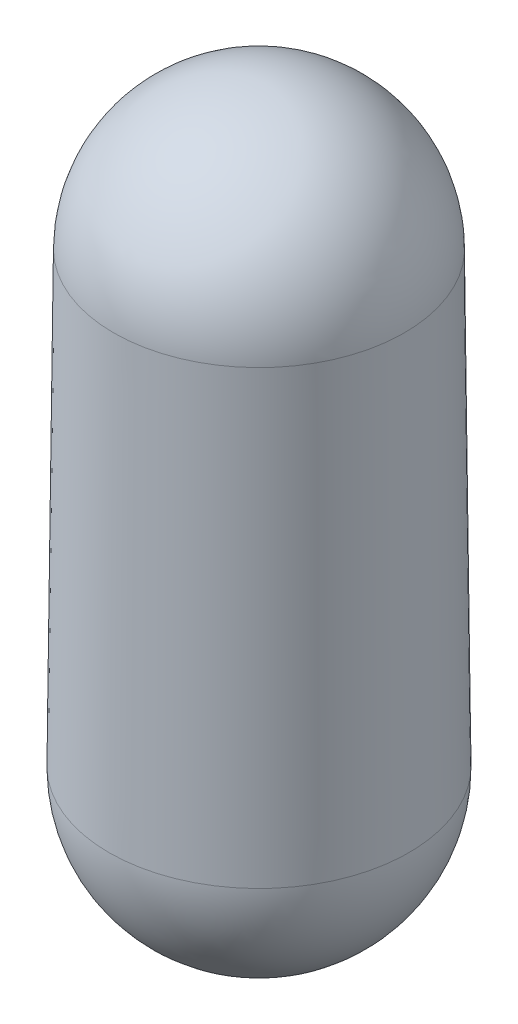
ISO-10303-21;
HEADER;
FILE_DESCRIPTION(('STEP AP214'),'2;1');
FILE_NAME('part.step','',(''),(''),'','','');
FILE_SCHEMA(('AUTOMOTIVE_DESIGN { 1 0 10303 214 1 1 1 1 }'));
ENDSEC;
DATA;
#1=APPLICATION_CONTEXT('core data for automotive mechanical design processes');
#2=APPLICATION_PROTOCOL_DEFINITION('international standard','automotive_design',2000,#1);
#3=PRODUCT_CONTEXT('',#1,'mechanical');
#4=PRODUCT('Part','Part','',(#3));
#5=PRODUCT_RELATED_PRODUCT_CATEGORY('part','',(#4));
#6=PRODUCT_DEFINITION_FORMATION('','',#4);
#7=PRODUCT_DEFINITION_CONTEXT('part definition',#1,'design');
#8=PRODUCT_DEFINITION('design','',#6,#7);
#9=PRODUCT_DEFINITION_SHAPE('','',#8);
#10=(LENGTH_UNIT() NAMED_UNIT(*) SI_UNIT(.MILLI.,.METRE.));
#11=(NAMED_UNIT(*) PLANE_ANGLE_UNIT() SI_UNIT($,.RADIAN.));
#12=(NAMED_UNIT(*) SI_UNIT($,.STERADIAN.) SOLID_ANGLE_UNIT());
#13=UNCERTAINTY_MEASURE_WITH_UNIT(LENGTH_MEASURE(1.E-05),#10,'distance_accuracy_value','');
#14=(GEOMETRIC_REPRESENTATION_CONTEXT(3) GLOBAL_UNCERTAINTY_ASSIGNED_CONTEXT((#13)) GLOBAL_UNIT_ASSIGNED_CONTEXT((#10,
#11,#12)) REPRESENTATION_CONTEXT('',''));
#15=CARTESIAN_POINT('',(0.,0.,0.));
#16=DIRECTION('',(0.,0.,1.));
#17=DIRECTION('',(1.,0.,0.));
#18=AXIS2_PLACEMENT_3D('',#15,#16,#17);
#19=CARTESIAN_POINT('',(0.,-2480.94431781166,0.));
#20=DIRECTION('',(0.,-1.,0.));
#21=DIRECTION('',(1.,0.,0.));
#22=AXIS2_PLACEMENT_3D('',#19,#20,#21);
#23=CYLINDRICAL_SURFACE('',#22,38.989);
#24=CARTESIAN_POINT('',(0.,-2511.17031781166,0.));
#25=DIRECTION('',(0.,-1.,0.));
#26=DIRECTION('',(1.,0.,0.));
#27=AXIS2_PLACEMENT_3D('',#24,#25,#26);
#28=CIRCLE('',#27,38.989);
#29=CARTESIAN_POINT('',(38.989,-2511.17031781166,0.));
#30=VERTEX_POINT('',#29);
#31=EDGE_CURVE('E164',#30,#30,#28,.T.);
#32=ORIENTED_EDGE('',*,*,#31,.T.);
#33=EDGE_LOOP('',(#32));
#34=FACE_BOUND('',#33,.T.);
#35=CARTESIAN_POINT('',(0.,-2501.51831781166,0.));
#36=DIRECTION('',(0.,1.,0.));
#37=DIRECTION('',(-1.,0.,0.));
#38=AXIS2_PLACEMENT_3D('',#35,#36,#37);
#39=CIRCLE('',#38,38.989);
#40=CARTESIAN_POINT('',(-38.989,-2501.51831781166,0.));
#41=VERTEX_POINT('',#40);
#42=EDGE_CURVE('E51',#41,#41,#39,.F.);
#43=ORIENTED_EDGE('',*,*,#42,.F.);
#44=EDGE_LOOP('',(#43));
#45=FACE_BOUND('',#44,.T.);
#46=ADVANCED_FACE('F47',(#34,#45),#23,.F.);
#47=CARTESIAN_POINT('',(0.,-2480.94431781166,0.));
#48=DIRECTION('',(0.,-1.,0.));
#49=DIRECTION('',(1.,0.,0.));
#50=AXIS2_PLACEMENT_3D('',#47,#48,#49);
#51=CYLINDRICAL_SURFACE('',#50,54.102);
#52=CARTESIAN_POINT('',(0.,-2509.58281781166,0.));
#53=DIRECTION('',(0.,-1.,0.));
#54=DIRECTION('',(1.,0.,0.));
#55=AXIS2_PLACEMENT_3D('',#52,#53,#54);
#56=CIRCLE('',#55,54.102);
#57=CARTESIAN_POINT('',(54.102,-2509.58281781166,0.));
#58=VERTEX_POINT('',#57);
#59=EDGE_CURVE('E11',#58,#58,#56,.F.);
#60=ORIENTED_EDGE('',*,*,#59,.F.);
#61=EDGE_LOOP('',(#60));
#62=FACE_BOUND('',#61,.T.);
#63=CARTESIAN_POINT('',(0.,-2511.17031781166,0.));
#64=DIRECTION('',(0.,-1.,0.));
#65=DIRECTION('',(1.,0.,0.));
#66=AXIS2_PLACEMENT_3D('',#63,#64,#65);
#67=CIRCLE('',#66,54.102);
#68=CARTESIAN_POINT('',(54.102,-2511.17031781166,0.));
#69=VERTEX_POINT('',#68);
#70=EDGE_CURVE('E60',#69,#69,#67,.T.);
#71=ORIENTED_EDGE('',*,*,#70,.F.);
#72=EDGE_LOOP('',(#71));
#73=FACE_BOUND('',#72,.T.);
#74=ADVANCED_FACE('F49',(#62,#73),#51,.T.);
#75=CARTESIAN_POINT('',(0.,-2511.17031781166,0.));
#76=DIRECTION('',(0.,-1.,0.));
#77=DIRECTION('',(1.,0.,0.));
#78=AXIS2_PLACEMENT_3D('',#75,#76,#77);
#79=PLANE('',#78);
#80=ORIENTED_EDGE('',*,*,#31,.F.);
#81=EDGE_LOOP('',(#80));
#82=FACE_BOUND('',#81,.T.);
#83=ORIENTED_EDGE('',*,*,#70,.T.);
#84=EDGE_LOOP('',(#83));
#85=FACE_BOUND('',#84,.T.);
#86=ADVANCED_FACE('F105',(#82,#85),#79,.T.);
#87=CARTESIAN_POINT('',(0.,-2217.88663417959,0.));
#88=DIRECTION('',(0.,-1.,0.));
#89=DIRECTION('',(1.,0.,0.));
#90=AXIS2_PLACEMENT_3D('',#87,#88,#89);
#91=CYLINDRICAL_SURFACE('',#90,95.25);
#92=CARTESIAN_POINT('',(0.,-2487.29431781166,0.));
#93=DIRECTION('',(0.,-1.,0.));
#94=DIRECTION('',(1.,0.,0.));
#95=AXIS2_PLACEMENT_3D('',#92,#93,#94);
#96=CIRCLE('',#95,95.25);
#97=CARTESIAN_POINT('',(95.25,-2487.29431781166,0.));
#98=VERTEX_POINT('',#97);
#99=EDGE_CURVE('E72',#98,#98,#96,.F.);
#100=ORIENTED_EDGE('',*,*,#99,.F.);
#101=EDGE_LOOP('',(#100));
#102=FACE_BOUND('',#101,.T.);
#103=CARTESIAN_POINT('',(0.,-2509.58281781166,0.));
#104=DIRECTION('',(0.,-1.,0.));
#105=DIRECTION('',(1.,0.,0.));
#106=AXIS2_PLACEMENT_3D('',#103,#104,#105);
#107=CIRCLE('',#106,95.25);
#108=CARTESIAN_POINT('',(95.25,-2509.58281781166,0.));
#109=VERTEX_POINT('',#108);
#110=EDGE_CURVE('E67',#109,#109,#107,.T.);
#111=ORIENTED_EDGE('',*,*,#110,.F.);
#112=EDGE_LOOP('',(#111));
#113=FACE_BOUND('',#112,.T.);
#114=ADVANCED_FACE('F102',(#102,#113),#91,.T.);
#115=CARTESIAN_POINT('',(0.,-2509.58281781166,0.));
#116=DIRECTION('',(0.,-1.,0.));
#117=DIRECTION('',(1.,0.,0.));
#118=AXIS2_PLACEMENT_3D('',#115,#116,#117);
#119=PLANE('',#118);
#120=CARTESIAN_POINT('',(53.8815367264154,-2509.58281781166,-53.8815367264145));
#121=DIRECTION('',(0.,-1.,0.));
#122=DIRECTION('',(0.,0.,-1.));
#123=AXIS2_PLACEMENT_3D('',#120,#121,#122);
#124=CIRCLE('',#123,9.52499999999999);
#125=CARTESIAN_POINT('',(53.8815367264155,-2509.58281781166,-63.4065367264145));
#126=VERTEX_POINT('',#125);
#127=EDGE_CURVE('E165',#126,#126,#124,.T.);
#128=ORIENTED_EDGE('',*,*,#127,.F.);
#129=EDGE_LOOP('',(#128));
#130=FACE_BOUND('',#129,.T.);
#131=CARTESIAN_POINT('',(-53.8815367264146,-2509.58281781166,-53.8815367264154));
#132=DIRECTION('',(0.,-1.,0.));
#133=DIRECTION('',(-1.,0.,0.));
#134=AXIS2_PLACEMENT_3D('',#131,#132,#133);
#135=CIRCLE('',#134,9.52499999999999);
#136=CARTESIAN_POINT('',(-63.4065367264146,-2509.58281781166,-53.8815367264154));
#137=VERTEX_POINT('',#136);
#138=EDGE_CURVE('E178',#137,#137,#135,.T.);
#139=ORIENTED_EDGE('',*,*,#138,.F.);
#140=EDGE_LOOP('',(#139));
#141=FACE_BOUND('',#140,.T.);
#142=CARTESIAN_POINT('',(-53.881536726415,-2509.58281781166,53.8815367264149));
#143=DIRECTION('',(0.,-1.,0.));
#144=DIRECTION('',(0.,0.,1.));
#145=AXIS2_PLACEMENT_3D('',#142,#143,#144);
#146=CIRCLE('',#145,9.52499999999999);
#147=CARTESIAN_POINT('',(-53.8815367264151,-2509.58281781166,63.4065367264149));
#148=VERTEX_POINT('',#147);
#149=EDGE_CURVE('E80',#148,#148,#146,.T.);
#150=ORIENTED_EDGE('',*,*,#149,.F.);
#151=EDGE_LOOP('',(#150));
#152=FACE_BOUND('',#151,.T.);
#153=CARTESIAN_POINT('',(53.881536726415,-2509.58281781166,53.8815367264149));
#154=DIRECTION('',(0.,-1.,0.));
#155=DIRECTION('',(1.,0.,0.));
#156=AXIS2_PLACEMENT_3D('',#153,#154,#155);
#157=CIRCLE('',#156,9.52499999999999);
#158=CARTESIAN_POINT('',(63.406536726415,-2509.58281781166,53.8815367264149));
#159=VERTEX_POINT('',#158);
#160=EDGE_CURVE('E68',#159,#159,#157,.T.);
#161=ORIENTED_EDGE('',*,*,#160,.F.);
#162=EDGE_LOOP('',(#161));
#163=FACE_BOUND('',#162,.T.);
#164=ORIENTED_EDGE('',*,*,#59,.T.);
#165=EDGE_LOOP('',(#164));
#166=FACE_BOUND('',#165,.T.);
#167=ORIENTED_EDGE('',*,*,#110,.T.);
#168=EDGE_LOOP('',(#167));
#169=FACE_BOUND('',#168,.T.);
#170=ADVANCED_FACE('F97',(#130,#141,#152,#163,#166,#169),#119,.T.);
#171=CARTESIAN_POINT('',(0.,-2487.29431781166,0.));
#172=DIRECTION('',(0.,-1.,0.));
#173=DIRECTION('',(1.,0.,0.));
#174=AXIS2_PLACEMENT_3D('',#171,#172,#173);
#175=PLANE('',#174);
#176=CARTESIAN_POINT('',(53.8815367264154,-2487.29431781166,-53.8815367264145));
#177=DIRECTION('',(0.,-1.,0.));
#178=DIRECTION('',(0.,0.,-1.));
#179=AXIS2_PLACEMENT_3D('',#176,#177,#178);
#180=CIRCLE('',#179,9.52499999999999);
#181=CARTESIAN_POINT('',(53.8815367264155,-2487.29431781166,-63.4065367264145));
#182=VERTEX_POINT('',#181);
#183=EDGE_CURVE('E168',#182,#182,#180,.T.);
#184=ORIENTED_EDGE('',*,*,#183,.T.);
#185=EDGE_LOOP('',(#184));
#186=FACE_BOUND('',#185,.T.);
#187=CARTESIAN_POINT('',(-53.8815367264146,-2487.29431781166,-53.8815367264154));
#188=DIRECTION('',(0.,-1.,0.));
#189=DIRECTION('',(-1.,0.,0.));
#190=AXIS2_PLACEMENT_3D('',#187,#188,#189);
#191=CIRCLE('',#190,9.52499999999999);
#192=CARTESIAN_POINT('',(-63.4065367264146,-2487.29431781166,-53.8815367264154));
#193=VERTEX_POINT('',#192);
#194=EDGE_CURVE('E181',#193,#193,#191,.T.);
#195=ORIENTED_EDGE('',*,*,#194,.T.);
#196=EDGE_LOOP('',(#195));
#197=FACE_BOUND('',#196,.T.);
#198=CARTESIAN_POINT('',(-53.881536726415,-2487.29431781166,53.8815367264149));
#199=DIRECTION('',(0.,-1.,0.));
#200=DIRECTION('',(0.,0.,1.));
#201=AXIS2_PLACEMENT_3D('',#198,#199,#200);
#202=CIRCLE('',#201,9.52499999999999);
#203=CARTESIAN_POINT('',(-53.8815367264151,-2487.29431781166,63.4065367264149));
#204=VERTEX_POINT('',#203);
#205=EDGE_CURVE('E75',#204,#204,#202,.T.);
#206=ORIENTED_EDGE('',*,*,#205,.T.);
#207=EDGE_LOOP('',(#206));
#208=FACE_BOUND('',#207,.T.);
#209=CARTESIAN_POINT('',(53.881536726415,-2487.29431781166,53.8815367264149));
#210=DIRECTION('',(0.,-1.,0.));
#211=DIRECTION('',(1.,0.,0.));
#212=AXIS2_PLACEMENT_3D('',#209,#210,#211);
#213=CIRCLE('',#212,9.52499999999999);
#214=CARTESIAN_POINT('',(63.406536726415,-2487.29431781166,53.8815367264149));
#215=VERTEX_POINT('',#214);
#216=EDGE_CURVE('E65',#215,#215,#213,.T.);
#217=ORIENTED_EDGE('',*,*,#216,.T.);
#218=EDGE_LOOP('',(#217));
#219=FACE_BOUND('',#218,.T.);
#220=CARTESIAN_POINT('',(0.,-2487.29431781166,0.));
#221=DIRECTION('',(0.,-1.,0.));
#222=DIRECTION('',(1.,0.,0.));
#223=AXIS2_PLACEMENT_3D('',#220,#221,#222);
#224=CIRCLE('',#223,54.102);
#225=CARTESIAN_POINT('',(54.102,-2487.29431781166,0.));
#226=VERTEX_POINT('',#225);
#227=EDGE_CURVE('E63',#226,#226,#224,.F.);
#228=ORIENTED_EDGE('',*,*,#227,.F.);
#229=EDGE_LOOP('',(#228));
#230=FACE_BOUND('',#229,.T.);
#231=ORIENTED_EDGE('',*,*,#99,.T.);
#232=EDGE_LOOP('',(#231));
#233=FACE_BOUND('',#232,.T.);
#234=ADVANCED_FACE('F93',(#186,#197,#208,#219,#230,#233),#175,.F.);
#235=CARTESIAN_POINT('',(0.,-2480.94431781166,0.));
#236=DIRECTION('',(0.,-1.,0.));
#237=DIRECTION('',(1.,0.,0.));
#238=AXIS2_PLACEMENT_3D('',#235,#236,#237);
#239=PLANE('',#238);
#240=CARTESIAN_POINT('',(0.,-2480.94431781166,0.));
#241=DIRECTION('',(0.,1.,0.));
#242=DIRECTION('',(-1.,0.,0.));
#243=AXIS2_PLACEMENT_3D('',#240,#241,#242);
#244=CIRCLE('',#243,45.339);
#245=CARTESIAN_POINT('',(-45.339,-2480.94431781166,0.));
#246=VERTEX_POINT('',#245);
#247=EDGE_CURVE('E173',#246,#246,#244,.T.);
#248=ORIENTED_EDGE('',*,*,#247,.F.);
#249=EDGE_LOOP('',(#248));
#250=FACE_BOUND('',#249,.T.);
#251=CARTESIAN_POINT('',(0.,-2480.94431781166,0.));
#252=DIRECTION('',(0.,-1.,0.));
#253=DIRECTION('',(1.,0.,0.));
#254=AXIS2_PLACEMENT_3D('',#251,#252,#253);
#255=CIRCLE('',#254,54.102);
#256=CARTESIAN_POINT('',(54.102,-2480.94431781166,0.));
#257=VERTEX_POINT('',#256);
#258=EDGE_CURVE('E55',#257,#257,#255,.T.);
#259=ORIENTED_EDGE('',*,*,#258,.F.);
#260=EDGE_LOOP('',(#259));
#261=FACE_BOUND('',#260,.T.);
#262=ADVANCED_FACE('F96',(#250,#261),#239,.F.);
#263=ORIENTED_EDGE('',*,*,#258,.T.);
#264=EDGE_LOOP('',(#263));
#265=FACE_BOUND('',#264,.T.);
#266=ORIENTED_EDGE('',*,*,#227,.T.);
#267=EDGE_LOOP('',(#266));
#268=FACE_BOUND('',#267,.T.);
#269=ADVANCED_FACE('F91',(#265,#268),#51,.T.);
#270=CARTESIAN_POINT('',(53.881536726415,-2480.94431781166,53.8815367264149));
#271=DIRECTION('',(0.,-1.,0.));
#272=DIRECTION('',(1.,0.,0.));
#273=AXIS2_PLACEMENT_3D('',#270,#271,#272);
#274=CYLINDRICAL_SURFACE('',#273,9.52499999999999);
#275=ORIENTED_EDGE('',*,*,#160,.T.);
#276=EDGE_LOOP('',(#275));
#277=FACE_BOUND('',#276,.T.);
#278=ORIENTED_EDGE('',*,*,#216,.F.);
#279=EDGE_LOOP('',(#278));
#280=FACE_BOUND('',#279,.T.);
#281=ADVANCED_FACE('F141',(#277,#280),#274,.F.);
#282=CARTESIAN_POINT('',(-53.881536726415,-2480.94431781166,53.8815367264149));
#283=DIRECTION('',(0.,-1.,0.));
#284=DIRECTION('',(0.,0.,1.));
#285=AXIS2_PLACEMENT_3D('',#282,#283,#284);
#286=CYLINDRICAL_SURFACE('',#285,9.52499999999999);
#287=ORIENTED_EDGE('',*,*,#149,.T.);
#288=EDGE_LOOP('',(#287));
#289=FACE_BOUND('',#288,.T.);
#290=ORIENTED_EDGE('',*,*,#205,.F.);
#291=EDGE_LOOP('',(#290));
#292=FACE_BOUND('',#291,.T.);
#293=ADVANCED_FACE('F137',(#289,#292),#286,.F.);
#294=CARTESIAN_POINT('',(-53.8815367264146,-2480.94431781166,-53.8815367264154));
#295=DIRECTION('',(0.,-1.,0.));
#296=DIRECTION('',(-1.,0.,0.));
#297=AXIS2_PLACEMENT_3D('',#294,#295,#296);
#298=CYLINDRICAL_SURFACE('',#297,9.52499999999999);
#299=ORIENTED_EDGE('',*,*,#138,.T.);
#300=EDGE_LOOP('',(#299));
#301=FACE_BOUND('',#300,.T.);
#302=ORIENTED_EDGE('',*,*,#194,.F.);
#303=EDGE_LOOP('',(#302));
#304=FACE_BOUND('',#303,.T.);
#305=ADVANCED_FACE('F133',(#301,#304),#298,.F.);
#306=CARTESIAN_POINT('',(53.8815367264154,-2480.94431781166,-53.8815367264145));
#307=DIRECTION('',(0.,-1.,0.));
#308=DIRECTION('',(0.,0.,-1.));
#309=AXIS2_PLACEMENT_3D('',#306,#307,#308);
#310=CYLINDRICAL_SURFACE('',#309,9.52499999999999);
#311=ORIENTED_EDGE('',*,*,#127,.T.);
#312=EDGE_LOOP('',(#311));
#313=FACE_BOUND('',#312,.T.);
#314=ORIENTED_EDGE('',*,*,#183,.F.);
#315=EDGE_LOOP('',(#314));
#316=FACE_BOUND('',#315,.T.);
#317=ADVANCED_FACE('F129',(#313,#316),#310,.F.);
#318=CARTESIAN_POINT('',(0.,-2501.51831781166,0.));
#319=DIRECTION('',(0.,1.,0.));
#320=DIRECTION('',(-1.,0.,0.));
#321=AXIS2_PLACEMENT_3D('',#318,#319,#320);
#322=PLANE('',#321);
#323=CARTESIAN_POINT('',(0.,-2501.51831781166,0.));
#324=DIRECTION('',(0.,1.,0.));
#325=DIRECTION('',(-1.,0.,0.));
#326=AXIS2_PLACEMENT_3D('',#323,#324,#325);
#327=CIRCLE('',#326,45.339);
#328=CARTESIAN_POINT('',(-45.339,-2501.51831781166,0.));
#329=VERTEX_POINT('',#328);
#330=EDGE_CURVE('E171',#329,#329,#327,.T.);
#331=ORIENTED_EDGE('',*,*,#330,.T.);
#332=EDGE_LOOP('',(#331));
#333=FACE_BOUND('',#332,.T.);
#334=ORIENTED_EDGE('',*,*,#42,.T.);
#335=EDGE_LOOP('',(#334));
#336=FACE_BOUND('',#335,.T.);
#337=ADVANCED_FACE('F132',(#333,#336),#322,.T.);
#338=CARTESIAN_POINT('',(0.,-2501.51831781166,0.));
#339=DIRECTION('',(0.,1.,0.));
#340=DIRECTION('',(-1.,0.,0.));
#341=AXIS2_PLACEMENT_3D('',#338,#339,#340);
#342=CYLINDRICAL_SURFACE('',#341,45.339);
#343=ORIENTED_EDGE('',*,*,#330,.F.);
#344=EDGE_LOOP('',(#343));
#345=FACE_BOUND('',#344,.T.);
#346=ORIENTED_EDGE('',*,*,#247,.T.);
#347=EDGE_LOOP('',(#346));
#348=FACE_BOUND('',#347,.T.);
#349=ADVANCED_FACE('F127',(#345,#348),#342,.F.);
#350=CLOSED_SHELL('',(#46,#74,#86,#114,#170,#234,#262,#269,#281,#293,#305,#317,#337,#349));
#351=MANIFOLD_SOLID_BREP('B2',#350);
#352=CARTESIAN_POINT('',(0.,-1989.40813526116,0.));
#353=DIRECTION('',(0.,1.,0.));
#354=DIRECTION('',(-1.,0.,0.));
#355=AXIS2_PLACEMENT_3D('',#352,#353,#354);
#356=SPHERICAL_SURFACE('',#355,505.47475050066);
#357=CARTESIAN_POINT('',(0.,-1989.40813526116,0.));
#358=DIRECTION('',(0.,1.,0.));
#359=DIRECTION('',(0.,0.,1.));
#360=AXIS2_PLACEMENT_3D('',#357,#358,#359);
#361=CIRCLE('',#360,505.47475050066);
#362=CARTESIAN_POINT('',(0.,-1989.40813526116,505.47475050066));
#363=VERTEX_POINT('',#362);
#364=EDGE_CURVE('E326',#363,#363,#361,.T.);
#365=ORIENTED_EDGE('',*,*,#364,.F.);
#366=EDGE_LOOP('',(#365));
#367=FACE_BOUND('',#366,.T.);
#368=CARTESIAN_POINT('',(0.,-2492.4038841435,0.));
#369=DIRECTION('',(0.,1.,0.));
#370=DIRECTION('',(0.,0.,1.));
#371=AXIS2_PLACEMENT_3D('',#368,#369,#370);
#372=CIRCLE('',#371,50.);
#373=CARTESIAN_POINT('',(0.,-2492.4038841435,50.));
#374=VERTEX_POINT('',#373);
#375=EDGE_CURVE('E331',#374,#374,#372,.T.);
#376=ORIENTED_EDGE('',*,*,#375,.T.);
#377=EDGE_LOOP('',(#376));
#378=FACE_BOUND('',#377,.T.);
#379=ADVANCED_FACE('F281',(#367,#378),#356,.T.);
#380=CARTESIAN_POINT('',(0.,-484.974379996435,4.98505236413368));
#381=DIRECTION('',(-1.,0.,0.));
#382=DIRECTION('',(0.,0.,1.));
#383=AXIS2_PLACEMENT_3D('',#380,#381,#382);
#384=CIRCLE('',#383,485.);
#385=TRIMMED_CURVE('',#384,(PARAMETER_VALUE(-1.58107496626714)),
(PARAMETER_VALUE(1.58107496626714)),.T.,.PARAMETER.);
#386=CARTESIAN_POINT('',(0.,-484.974379996435,0.));
#387=DIRECTION('',(0.,1.,0.));
#388=AXIS1_PLACEMENT('',#386,#387);
#389=SURFACE_OF_REVOLUTION('',#385,#388);
#390=CARTESIAN_POINT('',(0.,-479.989327632302,0.));
#391=DIRECTION('',(0.,1.,0.));
#392=DIRECTION('',(0.,0.,1.));
#393=AXIS2_PLACEMENT_3D('',#390,#391,#392);
#394=CIRCLE('',#393,489.959432360569);
#395=CARTESIAN_POINT('',(0.,-479.989327632302,489.959432360569));
#396=VERTEX_POINT('',#395);
#397=EDGE_CURVE('E325',#396,#396,#394,.T.);
#398=ORIENTED_EDGE('',*,*,#397,.T.);
#399=EDGE_LOOP('',(#398));
#400=FACE_BOUND('',#399,.T.);
#401=CARTESIAN_POINT('',(0.,0.,0.));
#402=VERTEX_POINT('',#401);
#403=VERTEX_LOOP('',#402);
#404=FACE_BOUND('',#403,.T.);
#405=ADVANCED_FACE('F297',(#400,#404),#389,.T.);
#406=CARTESIAN_POINT('',(0.,-479.989327632302,0.));
#407=DIRECTION('',(0.,-1.,0.));
#408=DIRECTION('',(0.,0.,-1.));
#409=AXIS2_PLACEMENT_3D('',#406,#407,#408);
#410=CONICAL_SURFACE('',#409,489.959432360569,0.0102786394722393);
#411=ORIENTED_EDGE('',*,*,#364,.T.);
#412=EDGE_LOOP('',(#411));
#413=FACE_BOUND('',#412,.T.);
#414=ORIENTED_EDGE('',*,*,#397,.F.);
#415=EDGE_LOOP('',(#414));
#416=FACE_BOUND('',#415,.T.);
#417=ADVANCED_FACE('F299',(#413,#416),#410,.T.);
#418=CARTESIAN_POINT('',(0.,-1540.,0.));
#419=DIRECTION('',(0.,-1.,0.));
#420=DIRECTION('',(0.,0.,-1.));
#421=AXIS2_PLACEMENT_3D('',#418,#419,#420);
#422=CYLINDRICAL_SURFACE('',#421,50.);
#423=ORIENTED_EDGE('',*,*,#375,.F.);
#424=EDGE_LOOP('',(#423));
#425=FACE_BOUND('',#424,.T.);
#426=CARTESIAN_POINT('',(0.,-2490.23319261307,0.));
#427=DIRECTION('',(0.,1.,0.));
#428=DIRECTION('',(0.,0.,1.));
#429=AXIS2_PLACEMENT_3D('',#426,#427,#428);
#430=CIRCLE('',#429,50.);
#431=CARTESIAN_POINT('',(-49.999999999998,-2490.23319261307,0.));
#432=VERTEX_POINT('',#431);
#433=EDGE_CURVE('E285',#432,#432,#430,.T.);
#434=ORIENTED_EDGE('',*,*,#433,.T.);
#435=EDGE_LOOP('',(#434));
#436=FACE_BOUND('',#435,.T.);
#437=ADVANCED_FACE('F306',(#425,#436),#422,.F.);
#438=CARTESIAN_POINT('',(0.,-1989.40813526116,0.));
#439=DIRECTION('',(0.,1.,0.));
#440=DIRECTION('',(-1.,0.,0.));
#441=AXIS2_PLACEMENT_3D('',#438,#439,#440);
#442=SPHERICAL_SURFACE('',#441,503.31475050066);
#443=CARTESIAN_POINT('',(0.,-1989.41922446168,0.));
#444=DIRECTION('',(0.,1.,0.));
#445=DIRECTION('',(0.,0.,1.));
#446=AXIS2_PLACEMENT_3D('',#443,#444,#445);
#447=CIRCLE('',#446,503.314750379081);
#448=CARTESIAN_POINT('',(-503.314750378499,-1989.41922446168,0.));
#449=VERTEX_POINT('',#448);
#450=EDGE_CURVE('E45',#449,#449,#447,.T.);
#451=CARTESIAN_POINT('',(-503.314750378499,-1989.41922446168,0.));
#452=CARTESIAN_POINT('',(-503.314673814716,-1993.27605415574,0.));
#453=CARTESIAN_POINT('',(-503.270249224182,-1997.13288253775,0.));
#454=CARTESIAN_POINT('',(-503.092764407085,-2004.84449938195,0.));
#455=CARTESIAN_POINT('',(-502.959704180521,-2008.69928784415,0.));
#456=CARTESIAN_POINT('',(-502.605008508836,-2016.40478755307,0.));
#457=CARTESIAN_POINT('',(-502.383373063714,-2020.25549879979,0.));
#458=CARTESIAN_POINT('',(-501.851646730706,-2027.95080922552,0.));
#459=CARTESIAN_POINT('',(-501.541555842821,-2031.79540840453,0.));
#460=CARTESIAN_POINT('',(-500.833081781539,-2039.47646299517,0.));
#461=CARTESIAN_POINT('',(-500.434698608143,-2043.3129184068,0.));
#462=CARTESIAN_POINT('',(-499.54985069236,-2050.97565808728,0.));
#463=CARTESIAN_POINT('',(-499.063385949973,-2054.80194235615,0.));
#464=CARTESIAN_POINT('',(-498.002631918096,-2062.44231774515,0.));
#465=CARTESIAN_POINT('',(-497.428342628606,-2066.25640886529,0.));
#466=CARTESIAN_POINT('',(-496.192243000102,-2073.87038239585,0.));
#467=CARTESIAN_POINT('',(-495.530432661088,-2077.67026480627,0.));
#468=CARTESIAN_POINT('',(-494.119640664388,-2085.2538128646,0.));
#469=CARTESIAN_POINT('',(-493.370659006703,-2089.03747851251,0.));
#470=CARTESIAN_POINT('',(-491.785920173953,-2096.58659356293,0.));
#471=CARTESIAN_POINT('',(-490.950162998889,-2100.35204296543,0.));
#472=CARTESIAN_POINT('',(-489.192314788062,-2107.86273566848,0.));
#473=CARTESIAN_POINT('',(-488.2702237523,-2111.60797896903,0.));
#474=CARTESIAN_POINT('',(-486.340195100329,-2119.07628028959,0.));
#475=CARTESIAN_POINT('',(-485.332257484121,-2122.7993383096,0.));
#476=CARTESIAN_POINT('',(-483.231068317158,-2130.22130161433,0.));
#477=CARTESIAN_POINT('',(-482.137816766402,-2133.92020689904,0.));
#478=CARTESIAN_POINT('',(-479.866577460522,-2141.29191004197,0.));
#479=CARTESIAN_POINT('',(-478.688589705398,-2144.96470790019,0.));
#480=CARTESIAN_POINT('',(-476.24850049991,-2152.28225529541,0.));
#481=CARTESIAN_POINT('',(-474.986399049546,-2155.92700483242,0.));
#482=CARTESIAN_POINT('',(-472.378749412696,-2163.1865295127,0.));
#483=CARTESIAN_POINT('',(-471.033201226211,-2166.80130465596,0.));
#484=CARTESIAN_POINT('',(-468.259369173772,-2173.99897031623,0.));
#485=CARTESIAN_POINT('',(-466.831085307818,-2177.58186083322,0.));
#486=CARTESIAN_POINT('',(-463.89253667487,-2184.71386385789,0.));
#487=CARTESIAN_POINT('',(-462.382271907875,-2188.26297636556,0.));
#488=CARTESIAN_POINT('',(-459.280559574185,-2195.32554783855,0.));
#489=CARTESIAN_POINT('',(-457.68911200749,-2198.83900680387,0.));
#490=CARTESIAN_POINT('',(-454.425875076891,-2205.8284145003,0.));
#491=CARTESIAN_POINT('',(-452.754085712988,-2209.3043632314,0.));
#492=CARTESIAN_POINT('',(-449.331048647192,-2216.21691358987,0.));
#493=CARTESIAN_POINT('',(-447.5798009453,-2219.65351521722,0.));
#494=CARTESIAN_POINT('',(-443.998772652603,-2226.48555529168,0.));
#495=CARTESIAN_POINT('',(-442.1689920618,-2229.88099373878,0.));
#496=CARTESIAN_POINT('',(-438.431864941165,-2236.62891312895,0.));
#497=CARTESIAN_POINT('',(-436.524518411334,-2239.98139407203,0.));
#498=CARTESIAN_POINT('',(-432.633267352347,-2246.64162683133,0.));
#499=CARTESIAN_POINT('',(-430.649362823191,-2249.94937864755,0.));
#500=CARTESIAN_POINT('',(-426.606044162429,-2256.51840516748,0.));
#501=CARTESIAN_POINT('',(-424.546630030824,-2259.7796798712,0.));
#502=CARTESIAN_POINT('',(-420.353380465183,-2266.25402874134,0.));
#503=CARTESIAN_POINT('',(-418.219545031148,-2269.46710290777,0.));
#504=CARTESIAN_POINT('',(-413.878580488701,-2275.84335275022,0.));
#505=CARTESIAN_POINT('',(-411.67145138029,-2279.00652842623,0.));
#506=CARTESIAN_POINT('',(-407.185065849278,-2285.28130970363,0.));
#507=CARTESIAN_POINT('',(-404.905809426677,-2288.39291530502,0.));
#508=CARTESIAN_POINT('',(-400.276373743248,-2294.56291210121,0.));
#509=CARTESIAN_POINT('',(-397.926194482418,-2297.62130329602,0.));
#510=CARTESIAN_POINT('',(-393.156155077753,-2303.68325506835,0.));
#511=CARTESIAN_POINT('',(-390.736294933918,-2306.68681564587,0.));
#512=CARTESIAN_POINT('',(-385.828172541415,-2312.63751894819,0.));
#513=CARTESIAN_POINT('',(-383.339910292749,-2315.584661673,0.));
#514=CARTESIAN_POINT('',(-378.296298615939,-2321.42097184858,0.));
#515=CARTESIAN_POINT('',(-375.740949187795,-2324.31013929936,0.));
#516=CARTESIAN_POINT('',(-370.56451352969,-2330.02897214265,0.));
#517=CARTESIAN_POINT('',(-367.943427299729,-2332.85863753518,0.));
#518=CARTESIAN_POINT('',(-362.636903154346,-2338.45697092169,0.));
#519=CARTESIAN_POINT('',(-359.951465238923,-2341.22563891568,0.));
#520=CARTESIAN_POINT('',(-354.517656845704,-2346.700514399,0.));
#521=CARTESIAN_POINT('',(-351.769286367907,-2349.40672188833,0.));
#522=CARTESIAN_POINT('',(-346.211065229817,-2354.75524626353,0.));
#523=CARTESIAN_POINT('',(-343.401214569524,-2357.39756314941,0.));
#524=CARTESIAN_POINT('',(-337.721517935602,-2362.61690998198,0.));
#525=CARTESIAN_POINT('',(-334.851671961974,-2365.19393992868,0.));
#526=CARTESIAN_POINT('',(-329.05350127514,-2370.28135104814,0.));
#527=CARTESIAN_POINT('',(-326.125176561935,-2372.79173222091,0.));
#528=CARTESIAN_POINT('',(-320.211595872872,-2377.74451917837,0.));
#529=CARTESIAN_POINT('',(-317.226339897015,-2380.18692496307,0.));
#530=CARTESIAN_POINT('',(-311.20047424497,-2385.00247045196,0.));
#531=CARTESIAN_POINT('',(-308.159864568782,-2387.37561015615,0.));
#532=CARTESIAN_POINT('',(-302.024898330132,-2392.05136939532,0.));
#533=CARTESIAN_POINT('',(-298.93054176767,-2394.35398893031,0.));
#534=CARTESIAN_POINT('',(-292.689716973137,-2398.88749100883,0.));
#535=CARTESIAN_POINT('',(-289.543248741067,-2401.11837355238,0.));
#536=CARTESIAN_POINT('',(-283.199863362462,-2405.50722273532,0.));
#537=CARTESIAN_POINT('',(-280.002946215928,-2407.66518937471,0.));
#538=CARTESIAN_POINT('',(-273.560352423332,-2411.90706636912,0.));
#539=CARTESIAN_POINT('',(-270.314675777271,-2413.99097672414,0.));
#540=CARTESIAN_POINT('',(-263.77627816758,-2418.08363990471,0.));
#541=CARTESIAN_POINT('',(-260.483557203949,-2420.09239273028,0.));
#542=CARTESIAN_POINT('',(-253.852811001705,-2424.03367932395,0.));
#543=CARTESIAN_POINT('',(-250.514785763092,-2425.96621309207,0.));
#544=CARTESIAN_POINT('',(-243.79519499457,-2429.75404032093,0.));
#545=CARTESIAN_POINT('',(-240.413629464662,-2431.60933378167,0.));
#546=CARTESIAN_POINT('',(-233.608745106163,-2435.24169996358,0.));
#547=CARTESIAN_POINT('',(-230.185426277571,-2437.01877268476,0.));
#548=CARTESIAN_POINT('',(-223.298844378898,-2440.4937582912,0.));
#549=CARTESIAN_POINT('',(-219.835581308817,-2442.19167117646,0.));
#550=CARTESIAN_POINT('',(-212.870941092946,-2445.50743984685,0.));
#551=CARTESIAN_POINT('',(-209.369563947156,-2447.12529563198,0.));
#552=CARTESIAN_POINT('',(-202.330545887078,-2450.28009514415,0.));
#553=CARTESIAN_POINT('',(-198.79290497279,-2451.81703887119,0.));
#554=CARTESIAN_POINT('',(-191.683228846563,-2454.80920206731,0.));
#555=CARTESIAN_POINT('',(-188.111193634625,-2456.2644215364,0.));
#556=CARTESIAN_POINT('',(-180.934616559653,-2459.09236720402,0.));
#557=CARTESIAN_POINT('',(-177.330074696619,-2460.46509340257,0.));
#558=CARTESIAN_POINT('',(-170.090389144198,-2463.12732711022,0.));
#559=CARTESIAN_POINT('',(-166.45524545481,-2464.41683461933,0.));
#560=CARTESIAN_POINT('',(-159.156277245983,-2466.91194950617,0.));
#561=CARTESIAN_POINT('',(-155.492452726545,-2468.11755688389,0.));
#562=CARTESIAN_POINT('',(-148.138059010381,-2470.44423440346,0.));
#563=CARTESIAN_POINT('',(-144.447489813657,-2471.56530454531,0.));
#564=CARTESIAN_POINT('',(-137.041557028795,-2473.7223151612,0.));
#565=CARTESIAN_POINT('',(-133.326193440657,-2474.75825563525,0.));
#566=CARTESIAN_POINT('',(-125.872635262035,-2476.74445947512,0.));
#567=CARTESIAN_POINT('',(-122.13444067155,-2477.69472284094,0.));
#568=CARTESIAN_POINT('',(-114.637195940257,-2479.5090702829,0.));
#569=CARTESIAN_POINT('',(-110.878145799448,-2480.37315435904,0.));
#570=CARTESIAN_POINT('',(-103.341176448575,-2482.01468664596,0.));
#571=CARTESIAN_POINT('',(-99.5632572385117,-2482.79213485674,0.));
#572=CARTESIAN_POINT('',(-91.9905461720735,-2484.2599843804,0.));
#573=CARTESIAN_POINT('',(-88.1957543156991,-2484.95038569328,0.));
#574=CARTESIAN_POINT('',(-80.5913034060875,-2486.24377728322,0.));
#575=CARTESIAN_POINT('',(-76.7816443528503,-2486.84676756027,0.));
#576=CARTESIAN_POINT('',(-69.149471944531,-2487.9650157945,0.));
#577=CARTESIAN_POINT('',(-65.3269585894489,-2488.48027375167,0.));
#578=CARTESIAN_POINT('',(-57.6710987992735,-2489.4227948842,0.));
#579=CARTESIAN_POINT('',(-53.8377523641802,-2489.85005805956,0.));
#580=CARTESIAN_POINT('',(-49.999999999998,-2490.23319261307,0.));
#581=B_SPLINE_CURVE_WITH_KNOTS('',3,(#451,#452,#453,#454,#455,#456,#457,#458,#459,#460,#461,
#462,#463,#464,#465,#466,#467,#468,#469,#470,#471,#472,#473,#474,#475,#476,#477,#478,#479,#480,
#481,#482,#483,#484,#485,#486,#487,#488,#489,#490,#491,#492,#493,#494,#495,#496,#497,#498,#499,
#500,#501,#502,#503,#504,#505,#506,#507,#508,#509,#510,#511,#512,#513,#514,#515,#516,#517,#518,
#519,#520,#521,#522,#523,#524,#525,#526,#527,#528,#529,#530,#531,#532,#533,#534,#535,#536,#537,
#538,#539,#540,#541,#542,#543,#544,#545,#546,#547,#548,#549,#550,#551,#552,#553,#554,#555,#556,
#557,#558,#559,#560,#561,#562,#563,#564,#565,#566,#567,#568,#569,#570,#571,#572,#573,#574,#575,
#576,#577,#578,#579,#580),.UNSPECIFIED.,.F.,.F.,(4,2,2,2,2,2,2,2,2,2,2,2,2,2,2,2,2,2,2,2,2,2,2,
2,2,2,2,2,2,2,2,2,2,2,2,2,2,2,2,2,2,2,2,2,2,2,2,2,2,2,2,2,2,2,2,2,2,2,2,2,2,2,2,2,4),(0.,
11.5702337443667,23.1404674887333,34.7107012331002,46.2809349774667,57.8511687218336,
69.4214024662002,80.9916362105671,92.561869954934,104.1321036993,115.702337443667,
127.272571188034,138.842804932401,150.413038676767,161.983272421134,173.553506165501,
185.123739909868,196.693973654234,208.264207398602,219.834441142968,231.404674887335,
242.974908631701,254.545142376068,266.115376120435,277.685609864802,289.255843609168,
300.826077353535,312.396311097902,323.966544842269,335.536778586636,347.107012331002,
358.677246075369,370.247479819736,381.817713564103,393.387947308469,404.958181052836,
416.528414797203,428.09864854157,439.668882285936,451.239116030303,462.80934977467,
474.379583519037,485.949817263403,497.52005100777,509.090284752137,520.660518496504,
532.23075224087,543.800985985237,555.371219729604,566.94145347397,578.511687218337,
590.081920962704,601.652154707071,613.222388451437,624.792622195804,636.362855940171,
647.933089684538,659.503323428904,671.073557173271,682.643790917638,694.214024662005,
705.784258406371,717.354492150738,728.924725895105,740.494959639472),.UNSPECIFIED.);
#582=EDGE_CURVE('BSEAM283',#449,#432,#581,.T.);
#583=ORIENTED_EDGE('',*,*,#450,.T.);
#584=ORIENTED_EDGE('',*,*,#433,.F.);
#585=ORIENTED_EDGE('',*,*,#582,.T.);
#586=ORIENTED_EDGE('',*,*,#582,.F.);
#587=EDGE_LOOP('',(#583,#585,#584,#586));
#588=FACE_BOUND('',#587,.T.);
#589=ADVANCED_FACE('F283',(#588),#442,.F.);
#590=CARTESIAN_POINT('',(0.,-484.974379996435,4.98505236413368));
#591=DIRECTION('',(-1.,0.,0.));
#592=DIRECTION('',(0.,0.,1.));
#593=AXIS2_PLACEMENT_3D('',#590,#591,#592);
#594=CIRCLE('',#593,482.84);
#595=TRIMMED_CURVE('',#594,(PARAMETER_VALUE(-1.58112094971595)),
(PARAMETER_VALUE(1.58112094971595)),.T.,.PARAMETER.);
#596=CARTESIAN_POINT('',(0.,-484.974379996435,0.));
#597=DIRECTION('',(0.,1.,0.));
#598=AXIS1_PLACEMENT('',#596,#597);
#599=SURFACE_OF_REVOLUTION('',#595,#598);
#600=CARTESIAN_POINT('',(0.,-480.011529102625,0.));
#601=DIRECTION('',(0.,1.,0.));
#602=DIRECTION('',(0.,0.,1.));
#603=AXIS2_PLACEMENT_3D('',#600,#601,#602);
#604=CIRCLE('',#603,487.799546462028);
#605=CARTESIAN_POINT('',(0.,-480.011529102625,487.799546462028));
#606=VERTEX_POINT('',#605);
#607=EDGE_CURVE('E290',#606,#606,#604,.T.);
#608=ORIENTED_EDGE('',*,*,#607,.F.);
#609=EDGE_LOOP('',(#608));
#610=FACE_BOUND('',#609,.T.);
#611=CARTESIAN_POINT('',(0.,-2.16011461799104,0.));
#612=VERTEX_POINT('',#611);
#613=VERTEX_LOOP('',#612);
#614=FACE_BOUND('',#613,.T.);
#615=ADVANCED_FACE('F313',(#610,#614),#599,.F.);
#616=CARTESIAN_POINT('',(0.,-480.011529102625,0.));
#617=DIRECTION('',(0.,-1.,0.));
#618=DIRECTION('',(0.,0.,-1.));
#619=AXIS2_PLACEMENT_3D('',#616,#617,#618);
#620=CONICAL_SURFACE('',#619,487.799546462028,0.0102786394722393);
#621=ORIENTED_EDGE('',*,*,#450,.F.);
#622=EDGE_LOOP('',(#621));
#623=FACE_BOUND('',#622,.T.);
#624=ORIENTED_EDGE('',*,*,#607,.T.);
#625=EDGE_LOOP('',(#624));
#626=FACE_BOUND('',#625,.T.);
#627=ADVANCED_FACE('F315',(#623,#626),#620,.F.);
#628=CLOSED_SHELL('',(#379,#405,#417,#437,#589,#615,#627));
#629=MANIFOLD_SOLID_BREP('B6',#628);
#630=ADVANCED_BREP_SHAPE_REPRESENTATION('',(#18,#351,#629),#14);
#631=SHAPE_DEFINITION_REPRESENTATION(#9,#630);
ENDSEC;
END-ISO-10303-21;
